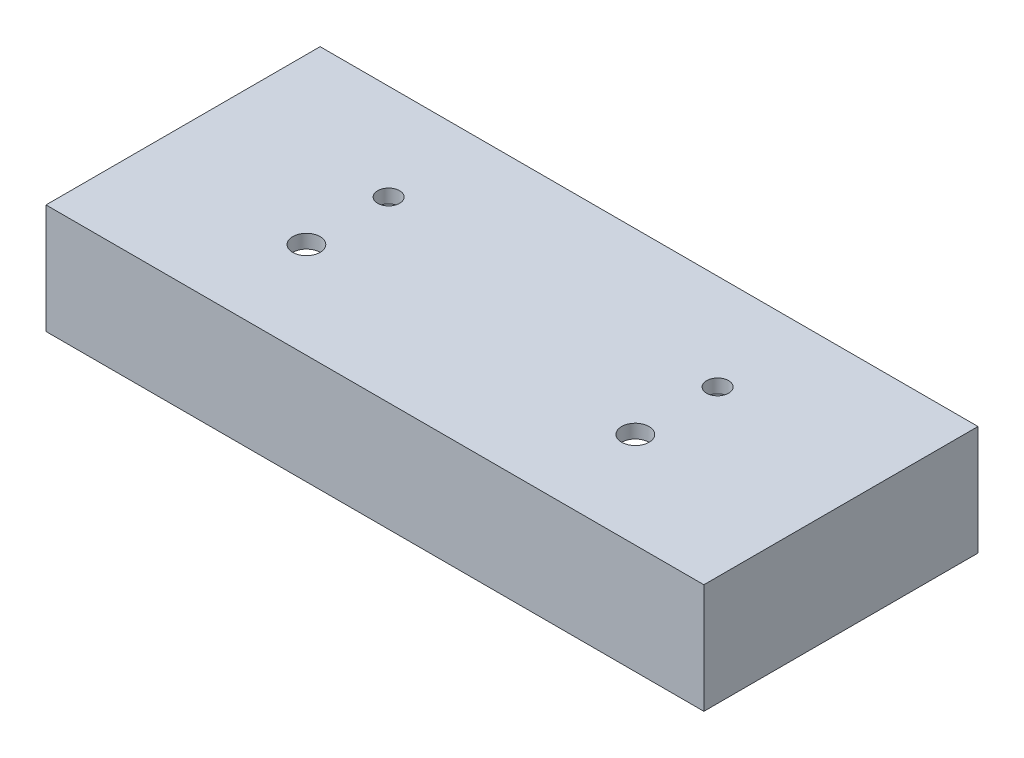
ISO-10303-21;
HEADER;
FILE_DESCRIPTION(('STEP AP214'),'2;1');
FILE_NAME('part.step','',(''),(''),'','','');
FILE_SCHEMA(('AUTOMOTIVE_DESIGN { 1 0 10303 214 1 1 1 1 }'));
ENDSEC;
DATA;
#1=APPLICATION_CONTEXT('core data for automotive mechanical design processes');
#2=APPLICATION_PROTOCOL_DEFINITION('international standard','automotive_design',2000,#1);
#3=PRODUCT_CONTEXT('',#1,'mechanical');
#4=PRODUCT('Part','Part','',(#3));
#5=PRODUCT_RELATED_PRODUCT_CATEGORY('part','',(#4));
#6=PRODUCT_DEFINITION_FORMATION('','',#4);
#7=PRODUCT_DEFINITION_CONTEXT('part definition',#1,'design');
#8=PRODUCT_DEFINITION('design','',#6,#7);
#9=PRODUCT_DEFINITION_SHAPE('','',#8);
#10=(LENGTH_UNIT() NAMED_UNIT(*) SI_UNIT(.MILLI.,.METRE.));
#11=(NAMED_UNIT(*) PLANE_ANGLE_UNIT() SI_UNIT($,.RADIAN.));
#12=(NAMED_UNIT(*) SI_UNIT($,.STERADIAN.) SOLID_ANGLE_UNIT());
#13=UNCERTAINTY_MEASURE_WITH_UNIT(LENGTH_MEASURE(1.E-05),#10,'distance_accuracy_value','');
#14=(GEOMETRIC_REPRESENTATION_CONTEXT(3) GLOBAL_UNCERTAINTY_ASSIGNED_CONTEXT((#13)) GLOBAL_UNIT_ASSIGNED_CONTEXT((#10,
#11,#12)) REPRESENTATION_CONTEXT('',''));
#15=CARTESIAN_POINT('',(0.,0.,0.));
#16=DIRECTION('',(0.,0.,1.));
#17=DIRECTION('',(1.,0.,0.));
#18=AXIS2_PLACEMENT_3D('',#15,#16,#17);
#19=CARTESIAN_POINT('',(152.4,50.8,63.5));
#20=DIRECTION('',(-1.,0.,0.));
#21=DIRECTION('',(0.,0.,1.));
#22=AXIS2_PLACEMENT_3D('',#19,#20,#21);
#23=PLANE('',#22);
#24=DIRECTION('',(0.,0.,-1.));
#25=VECTOR('',#24,1.);
#26=CARTESIAN_POINT('',(152.4,0.,63.5));
#27=LINE('',#26,#25);
#28=CARTESIAN_POINT('',(152.4,0.,63.5));
#29=VERTEX_POINT('',#28);
#30=CARTESIAN_POINT('',(152.4,0.,-63.5));
#31=VERTEX_POINT('',#30);
#32=EDGE_CURVE('E149',#29,#31,#27,.T.);
#33=ORIENTED_EDGE('',*,*,#32,.T.);
#34=DIRECTION('',(0.,-1.,0.));
#35=VECTOR('',#34,1.);
#36=CARTESIAN_POINT('',(152.4,50.8,-63.5));
#37=LINE('',#36,#35);
#38=CARTESIAN_POINT('',(152.4,50.8,-63.5));
#39=VERTEX_POINT('',#38);
#40=EDGE_CURVE('E11',#39,#31,#37,.T.);
#41=ORIENTED_EDGE('',*,*,#40,.F.);
#42=DIRECTION('',(0.,0.,-1.));
#43=VECTOR('',#42,1.);
#44=CARTESIAN_POINT('',(152.4,50.8,63.5));
#45=LINE('',#44,#43);
#46=CARTESIAN_POINT('',(152.4,50.8,63.5));
#47=VERTEX_POINT('',#46);
#48=EDGE_CURVE('E153',#47,#39,#45,.T.);
#49=ORIENTED_EDGE('',*,*,#48,.F.);
#50=DIRECTION('',(0.,-1.,0.));
#51=VECTOR('',#50,1.);
#52=CARTESIAN_POINT('',(152.4,50.8,63.5));
#53=LINE('',#52,#51);
#54=EDGE_CURVE('E159',#47,#29,#53,.T.);
#55=ORIENTED_EDGE('',*,*,#54,.T.);
#56=EDGE_LOOP('',(#33,#41,#49,#55));
#57=FACE_BOUND('',#56,.T.);
#58=ADVANCED_FACE('F36',(#57),#23,.F.);
#59=CARTESIAN_POINT('',(-152.4,50.8,-63.5));
#60=DIRECTION('',(0.,0.,1.));
#61=DIRECTION('',(1.,0.,0.));
#62=AXIS2_PLACEMENT_3D('',#59,#60,#61);
#63=PLANE('',#62);
#64=DIRECTION('',(-1.,0.,0.));
#65=VECTOR('',#64,1.);
#66=CARTESIAN_POINT('',(-152.4,0.,-63.5));
#67=LINE('',#66,#65);
#68=CARTESIAN_POINT('',(-152.4,0.,-63.5));
#69=VERTEX_POINT('',#68);
#70=EDGE_CURVE('E162',#31,#69,#67,.T.);
#71=ORIENTED_EDGE('',*,*,#70,.T.);
#72=DIRECTION('',(0.,-1.,0.));
#73=VECTOR('',#72,1.);
#74=CARTESIAN_POINT('',(-152.4,50.8,-63.5));
#75=LINE('',#74,#73);
#76=CARTESIAN_POINT('',(-152.4,50.8,-63.5));
#77=VERTEX_POINT('',#76);
#78=EDGE_CURVE('E44',#77,#69,#75,.T.);
#79=ORIENTED_EDGE('',*,*,#78,.F.);
#80=DIRECTION('',(-1.,0.,0.));
#81=VECTOR('',#80,1.);
#82=CARTESIAN_POINT('',(-152.4,50.8,-63.5));
#83=LINE('',#82,#81);
#84=EDGE_CURVE('E89',#39,#77,#83,.T.);
#85=ORIENTED_EDGE('',*,*,#84,.F.);
#86=ORIENTED_EDGE('',*,*,#40,.T.);
#87=EDGE_LOOP('',(#71,#79,#85,#86));
#88=FACE_BOUND('',#87,.T.);
#89=ADVANCED_FACE('F225',(#88),#63,.F.);
#90=CARTESIAN_POINT('',(-152.4,50.8,63.5));
#91=DIRECTION('',(1.,0.,0.));
#92=DIRECTION('',(0.,0.,-1.));
#93=AXIS2_PLACEMENT_3D('',#90,#91,#92);
#94=PLANE('',#93);
#95=DIRECTION('',(0.,0.,1.));
#96=VECTOR('',#95,1.);
#97=CARTESIAN_POINT('',(-152.4,0.,63.5));
#98=LINE('',#97,#96);
#99=CARTESIAN_POINT('',(-152.4,0.,63.5));
#100=VERTEX_POINT('',#99);
#101=EDGE_CURVE('E164',#69,#100,#98,.T.);
#102=ORIENTED_EDGE('',*,*,#101,.T.);
#103=DIRECTION('',(0.,-1.,0.));
#104=VECTOR('',#103,1.);
#105=CARTESIAN_POINT('',(-152.4,50.8,63.5));
#106=LINE('',#105,#104);
#107=CARTESIAN_POINT('',(-152.4,50.8,63.5));
#108=VERTEX_POINT('',#107);
#109=EDGE_CURVE('E168',#108,#100,#106,.T.);
#110=ORIENTED_EDGE('',*,*,#109,.F.);
#111=DIRECTION('',(0.,0.,1.));
#112=VECTOR('',#111,1.);
#113=CARTESIAN_POINT('',(-152.4,50.8,63.5));
#114=LINE('',#113,#112);
#115=EDGE_CURVE('E156',#77,#108,#114,.T.);
#116=ORIENTED_EDGE('',*,*,#115,.F.);
#117=ORIENTED_EDGE('',*,*,#78,.T.);
#118=EDGE_LOOP('',(#102,#110,#116,#117));
#119=FACE_BOUND('',#118,.T.);
#120=ADVANCED_FACE('F230',(#119),#94,.F.);
#121=CARTESIAN_POINT('',(-152.4,50.8,63.5));
#122=DIRECTION('',(0.,0.,-1.));
#123=DIRECTION('',(-1.,0.,0.));
#124=AXIS2_PLACEMENT_3D('',#121,#122,#123);
#125=PLANE('',#124);
#126=DIRECTION('',(1.,0.,0.));
#127=VECTOR('',#126,1.);
#128=CARTESIAN_POINT('',(-152.4,0.,63.5));
#129=LINE('',#128,#127);
#130=EDGE_CURVE('E82',#100,#29,#129,.T.);
#131=ORIENTED_EDGE('',*,*,#130,.T.);
#132=ORIENTED_EDGE('',*,*,#54,.F.);
#133=DIRECTION('',(1.,0.,0.));
#134=VECTOR('',#133,1.);
#135=CARTESIAN_POINT('',(-152.4,50.8,63.5));
#136=LINE('',#135,#134);
#137=EDGE_CURVE('E61',#108,#47,#136,.T.);
#138=ORIENTED_EDGE('',*,*,#137,.F.);
#139=ORIENTED_EDGE('',*,*,#109,.T.);
#140=EDGE_LOOP('',(#131,#132,#138,#139));
#141=FACE_BOUND('',#140,.T.);
#142=ADVANCED_FACE('F218',(#141),#125,.F.);
#143=CARTESIAN_POINT('',(0.,50.8,0.));
#144=DIRECTION('',(0.,-1.,0.));
#145=DIRECTION('',(0.,0.,-1.));
#146=AXIS2_PLACEMENT_3D('',#143,#144,#145);
#147=PLANE('',#146);
#148=CARTESIAN_POINT('',(76.1999999999999,50.8,-19.05));
#149=DIRECTION('',(0.,1.,0.));
#150=DIRECTION('',(0.,0.,-1.));
#151=AXIS2_PLACEMENT_3D('',#148,#149,#150);
#152=CIRCLE('',#151,5.08);
#153=CARTESIAN_POINT('',(76.1999999999999,50.8,-24.13));
#154=VERTEX_POINT('',#153);
#155=EDGE_CURVE('E203',#154,#154,#152,.T.);
#156=ORIENTED_EDGE('',*,*,#155,.F.);
#157=EDGE_LOOP('',(#156));
#158=FACE_BOUND('',#157,.T.);
#159=CARTESIAN_POINT('',(-76.2,50.8,19.05));
#160=DIRECTION('',(0.,1.,0.));
#161=DIRECTION('',(0.,0.,1.));
#162=AXIS2_PLACEMENT_3D('',#159,#160,#161);
#163=CIRCLE('',#162,6.35);
#164=CARTESIAN_POINT('',(-76.2,50.8,25.4));
#165=VERTEX_POINT('',#164);
#166=EDGE_CURVE('E205',#165,#165,#163,.T.);
#167=ORIENTED_EDGE('',*,*,#166,.F.);
#168=EDGE_LOOP('',(#167));
#169=FACE_BOUND('',#168,.T.);
#170=CARTESIAN_POINT('',(76.2,50.8,19.05));
#171=DIRECTION('',(0.,1.,0.));
#172=DIRECTION('',(0.,0.,1.));
#173=AXIS2_PLACEMENT_3D('',#170,#171,#172);
#174=CIRCLE('',#173,6.35);
#175=CARTESIAN_POINT('',(76.2,50.8,25.4));
#176=VERTEX_POINT('',#175);
#177=EDGE_CURVE('E209',#176,#176,#174,.T.);
#178=ORIENTED_EDGE('',*,*,#177,.F.);
#179=EDGE_LOOP('',(#178));
#180=FACE_BOUND('',#179,.T.);
#181=CARTESIAN_POINT('',(-76.2000000000001,50.8,-19.05));
#182=DIRECTION('',(0.,1.,0.));
#183=DIRECTION('',(0.,0.,1.));
#184=AXIS2_PLACEMENT_3D('',#181,#182,#183);
#185=CIRCLE('',#184,5.08);
#186=CARTESIAN_POINT('',(-76.2000000000001,50.8,-13.97));
#187=VERTEX_POINT('',#186);
#188=EDGE_CURVE('E137',#187,#187,#185,.T.);
#189=ORIENTED_EDGE('',*,*,#188,.F.);
#190=EDGE_LOOP('',(#189));
#191=FACE_BOUND('',#190,.T.);
#192=ORIENTED_EDGE('',*,*,#48,.T.);
#193=ORIENTED_EDGE('',*,*,#84,.T.);
#194=ORIENTED_EDGE('',*,*,#115,.T.);
#195=ORIENTED_EDGE('',*,*,#137,.T.);
#196=EDGE_LOOP('',(#192,#193,#194,#195));
#197=FACE_BOUND('',#196,.T.);
#198=ADVANCED_FACE('F215',(#158,#169,#180,#191,#197),#147,.F.);
#199=CARTESIAN_POINT('',(0.,0.,0.));
#200=DIRECTION('',(0.,-1.,0.));
#201=DIRECTION('',(0.,0.,-1.));
#202=AXIS2_PLACEMENT_3D('',#199,#200,#201);
#203=PLANE('',#202);
#204=DIRECTION('',(0.,0.,1.));
#205=VECTOR('',#204,1.);
#206=CARTESIAN_POINT('',(139.7,0.,50.8));
#207=LINE('',#206,#205);
#208=CARTESIAN_POINT('',(139.7,0.,-50.8));
#209=VERTEX_POINT('',#208);
#210=CARTESIAN_POINT('',(139.7,0.,50.8));
#211=VERTEX_POINT('',#210);
#212=EDGE_CURVE('E52',#209,#211,#207,.T.);
#213=ORIENTED_EDGE('',*,*,#212,.F.);
#214=DIRECTION('',(1.,0.,0.));
#215=VECTOR('',#214,1.);
#216=CARTESIAN_POINT('',(-139.7,0.,-50.8));
#217=LINE('',#216,#215);
#218=CARTESIAN_POINT('',(-139.7,0.,-50.8));
#219=VERTEX_POINT('',#218);
#220=EDGE_CURVE('E131',#219,#209,#217,.T.);
#221=ORIENTED_EDGE('',*,*,#220,.F.);
#222=DIRECTION('',(0.,0.,-1.));
#223=VECTOR('',#222,1.);
#224=CARTESIAN_POINT('',(-139.7,0.,50.8));
#225=LINE('',#224,#223);
#226=CARTESIAN_POINT('',(-139.7,0.,50.8));
#227=VERTEX_POINT('',#226);
#228=EDGE_CURVE('E134',#227,#219,#225,.T.);
#229=ORIENTED_EDGE('',*,*,#228,.F.);
#230=DIRECTION('',(-1.,0.,0.));
#231=VECTOR('',#230,1.);
#232=CARTESIAN_POINT('',(-139.7,0.,50.8));
#233=LINE('',#232,#231);
#234=EDGE_CURVE('E143',#211,#227,#233,.T.);
#235=ORIENTED_EDGE('',*,*,#234,.F.);
#236=EDGE_LOOP('',(#213,#221,#229,#235));
#237=FACE_BOUND('',#236,.T.);
#238=ORIENTED_EDGE('',*,*,#32,.F.);
#239=ORIENTED_EDGE('',*,*,#130,.F.);
#240=ORIENTED_EDGE('',*,*,#101,.F.);
#241=ORIENTED_EDGE('',*,*,#70,.F.);
#242=EDGE_LOOP('',(#238,#239,#240,#241));
#243=FACE_BOUND('',#242,.T.);
#244=ADVANCED_FACE('F217',(#237,#243),#203,.T.);
#245=CARTESIAN_POINT('',(139.7,44.45,50.8));
#246=DIRECTION('',(1.,0.,0.));
#247=DIRECTION('',(0.,0.,-1.));
#248=AXIS2_PLACEMENT_3D('',#245,#246,#247);
#249=PLANE('',#248);
#250=ORIENTED_EDGE('',*,*,#212,.T.);
#251=DIRECTION('',(0.,-1.,0.));
#252=VECTOR('',#251,1.);
#253=CARTESIAN_POINT('',(139.7,44.45,50.8));
#254=LINE('',#253,#252);
#255=CARTESIAN_POINT('',(139.7,44.45,50.8));
#256=VERTEX_POINT('',#255);
#257=EDGE_CURVE('E109',#256,#211,#254,.T.);
#258=ORIENTED_EDGE('',*,*,#257,.F.);
#259=DIRECTION('',(0.,0.,1.));
#260=VECTOR('',#259,1.);
#261=CARTESIAN_POINT('',(139.7,44.45,50.8));
#262=LINE('',#261,#260);
#263=CARTESIAN_POINT('',(139.7,44.45,-50.8));
#264=VERTEX_POINT('',#263);
#265=EDGE_CURVE('E113',#264,#256,#262,.T.);
#266=ORIENTED_EDGE('',*,*,#265,.F.);
#267=DIRECTION('',(0.,-1.,0.));
#268=VECTOR('',#267,1.);
#269=CARTESIAN_POINT('',(139.7,44.45,-50.8));
#270=LINE('',#269,#268);
#271=EDGE_CURVE('E147',#264,#209,#270,.T.);
#272=ORIENTED_EDGE('',*,*,#271,.T.);
#273=EDGE_LOOP('',(#250,#258,#266,#272));
#274=FACE_BOUND('',#273,.T.);
#275=ADVANCED_FACE('F111',(#274),#249,.F.);
#276=CARTESIAN_POINT('',(-139.7,44.45,-50.8));
#277=DIRECTION('',(0.,0.,-1.));
#278=DIRECTION('',(-1.,0.,0.));
#279=AXIS2_PLACEMENT_3D('',#276,#277,#278);
#280=PLANE('',#279);
#281=ORIENTED_EDGE('',*,*,#220,.T.);
#282=ORIENTED_EDGE('',*,*,#271,.F.);
#283=DIRECTION('',(1.,0.,0.));
#284=VECTOR('',#283,1.);
#285=CARTESIAN_POINT('',(-139.7,44.45,-50.8));
#286=LINE('',#285,#284);
#287=CARTESIAN_POINT('',(-139.7,44.45,-50.8));
#288=VERTEX_POINT('',#287);
#289=EDGE_CURVE('E119',#288,#264,#286,.T.);
#290=ORIENTED_EDGE('',*,*,#289,.F.);
#291=DIRECTION('',(0.,-1.,0.));
#292=VECTOR('',#291,1.);
#293=CARTESIAN_POINT('',(-139.7,44.45,-50.8));
#294=LINE('',#293,#292);
#295=EDGE_CURVE('E150',#288,#219,#294,.T.);
#296=ORIENTED_EDGE('',*,*,#295,.T.);
#297=EDGE_LOOP('',(#281,#282,#290,#296));
#298=FACE_BOUND('',#297,.T.);
#299=ADVANCED_FACE('F238',(#298),#280,.F.);
#300=CARTESIAN_POINT('',(-139.7,44.45,50.8));
#301=DIRECTION('',(-1.,0.,0.));
#302=DIRECTION('',(0.,0.,1.));
#303=AXIS2_PLACEMENT_3D('',#300,#301,#302);
#304=PLANE('',#303);
#305=ORIENTED_EDGE('',*,*,#228,.T.);
#306=ORIENTED_EDGE('',*,*,#295,.F.);
#307=DIRECTION('',(0.,0.,-1.));
#308=VECTOR('',#307,1.);
#309=CARTESIAN_POINT('',(-139.7,44.45,50.8));
#310=LINE('',#309,#308);
#311=CARTESIAN_POINT('',(-139.7,44.45,50.8));
#312=VERTEX_POINT('',#311);
#313=EDGE_CURVE('E127',#312,#288,#310,.T.);
#314=ORIENTED_EDGE('',*,*,#313,.F.);
#315=DIRECTION('',(0.,-1.,0.));
#316=VECTOR('',#315,1.);
#317=CARTESIAN_POINT('',(-139.7,44.45,50.8));
#318=LINE('',#317,#316);
#319=EDGE_CURVE('E118',#312,#227,#318,.T.);
#320=ORIENTED_EDGE('',*,*,#319,.T.);
#321=EDGE_LOOP('',(#305,#306,#314,#320));
#322=FACE_BOUND('',#321,.T.);
#323=ADVANCED_FACE('F309',(#322),#304,.F.);
#324=CARTESIAN_POINT('',(-139.7,44.45,50.8));
#325=DIRECTION('',(0.,0.,1.));
#326=DIRECTION('',(1.,0.,0.));
#327=AXIS2_PLACEMENT_3D('',#324,#325,#326);
#328=PLANE('',#327);
#329=ORIENTED_EDGE('',*,*,#234,.T.);
#330=ORIENTED_EDGE('',*,*,#319,.F.);
#331=DIRECTION('',(-1.,0.,0.));
#332=VECTOR('',#331,1.);
#333=CARTESIAN_POINT('',(-139.7,44.45,50.8));
#334=LINE('',#333,#332);
#335=EDGE_CURVE('E122',#256,#312,#334,.T.);
#336=ORIENTED_EDGE('',*,*,#335,.F.);
#337=ORIENTED_EDGE('',*,*,#257,.T.);
#338=EDGE_LOOP('',(#329,#330,#336,#337));
#339=FACE_BOUND('',#338,.T.);
#340=ADVANCED_FACE('F123',(#339),#328,.F.);
#341=CARTESIAN_POINT('',(0.,44.45,0.));
#342=DIRECTION('',(0.,-1.,0.));
#343=DIRECTION('',(0.,0.,-1.));
#344=AXIS2_PLACEMENT_3D('',#341,#342,#343);
#345=PLANE('',#344);
#346=CARTESIAN_POINT('',(76.1999999999999,44.45,-19.05));
#347=DIRECTION('',(0.,-1.,0.));
#348=DIRECTION('',(0.,0.,-1.));
#349=AXIS2_PLACEMENT_3D('',#346,#347,#348);
#350=CIRCLE('',#349,5.08);
#351=CARTESIAN_POINT('',(76.1999999999999,44.45,-24.13));
#352=VERTEX_POINT('',#351);
#353=EDGE_CURVE('E39',#352,#352,#350,.T.);
#354=ORIENTED_EDGE('',*,*,#353,.F.);
#355=EDGE_LOOP('',(#354));
#356=FACE_BOUND('',#355,.T.);
#357=CARTESIAN_POINT('',(-76.2,44.45,19.05));
#358=DIRECTION('',(0.,-1.,0.));
#359=DIRECTION('',(0.,0.,-1.));
#360=AXIS2_PLACEMENT_3D('',#357,#358,#359);
#361=CIRCLE('',#360,6.35);
#362=CARTESIAN_POINT('',(-76.2,44.45,12.7));
#363=VERTEX_POINT('',#362);
#364=EDGE_CURVE('E177',#363,#363,#361,.T.);
#365=ORIENTED_EDGE('',*,*,#364,.F.);
#366=EDGE_LOOP('',(#365));
#367=FACE_BOUND('',#366,.T.);
#368=CARTESIAN_POINT('',(76.2,44.45,19.05));
#369=DIRECTION('',(0.,-1.,0.));
#370=DIRECTION('',(0.,0.,-1.));
#371=AXIS2_PLACEMENT_3D('',#368,#369,#370);
#372=CIRCLE('',#371,6.35);
#373=CARTESIAN_POINT('',(76.2,44.45,12.7));
#374=VERTEX_POINT('',#373);
#375=EDGE_CURVE('E175',#374,#374,#372,.T.);
#376=ORIENTED_EDGE('',*,*,#375,.F.);
#377=EDGE_LOOP('',(#376));
#378=FACE_BOUND('',#377,.T.);
#379=CARTESIAN_POINT('',(-76.2000000000001,44.45,-19.05));
#380=DIRECTION('',(0.,-1.,0.));
#381=DIRECTION('',(0.,0.,-1.));
#382=AXIS2_PLACEMENT_3D('',#379,#380,#381);
#383=CIRCLE('',#382,5.08);
#384=CARTESIAN_POINT('',(-76.2000000000001,44.45,-24.13));
#385=VERTEX_POINT('',#384);
#386=EDGE_CURVE('E172',#385,#385,#383,.T.);
#387=ORIENTED_EDGE('',*,*,#386,.F.);
#388=EDGE_LOOP('',(#387));
#389=FACE_BOUND('',#388,.T.);
#390=ORIENTED_EDGE('',*,*,#265,.T.);
#391=ORIENTED_EDGE('',*,*,#335,.T.);
#392=ORIENTED_EDGE('',*,*,#313,.T.);
#393=ORIENTED_EDGE('',*,*,#289,.T.);
#394=EDGE_LOOP('',(#390,#391,#392,#393));
#395=FACE_BOUND('',#394,.T.);
#396=ADVANCED_FACE('F129',(#356,#367,#378,#389,#395),#345,.T.);
#397=CARTESIAN_POINT('',(-76.2000000000001,38.1,-19.05));
#398=DIRECTION('',(0.,1.,0.));
#399=DIRECTION('',(0.,0.,1.));
#400=AXIS2_PLACEMENT_3D('',#397,#398,#399);
#401=CYLINDRICAL_SURFACE('',#400,5.08);
#402=ORIENTED_EDGE('',*,*,#386,.T.);
#403=EDGE_LOOP('',(#402));
#404=FACE_BOUND('',#403,.T.);
#405=ORIENTED_EDGE('',*,*,#188,.T.);
#406=EDGE_LOOP('',(#405));
#407=FACE_BOUND('',#406,.T.);
#408=ADVANCED_FACE('F189',(#404,#407),#401,.F.);
#409=CARTESIAN_POINT('',(76.2,38.1,19.05));
#410=DIRECTION('',(0.,1.,0.));
#411=DIRECTION('',(0.,0.,1.));
#412=AXIS2_PLACEMENT_3D('',#409,#410,#411);
#413=CYLINDRICAL_SURFACE('',#412,6.35);
#414=ORIENTED_EDGE('',*,*,#375,.T.);
#415=EDGE_LOOP('',(#414));
#416=FACE_BOUND('',#415,.T.);
#417=ORIENTED_EDGE('',*,*,#177,.T.);
#418=EDGE_LOOP('',(#417));
#419=FACE_BOUND('',#418,.T.);
#420=ADVANCED_FACE('F198',(#416,#419),#413,.F.);
#421=CARTESIAN_POINT('',(-76.2,38.1,19.05));
#422=DIRECTION('',(0.,1.,0.));
#423=DIRECTION('',(0.,0.,1.));
#424=AXIS2_PLACEMENT_3D('',#421,#422,#423);
#425=CYLINDRICAL_SURFACE('',#424,6.35);
#426=ORIENTED_EDGE('',*,*,#364,.T.);
#427=EDGE_LOOP('',(#426));
#428=FACE_BOUND('',#427,.T.);
#429=ORIENTED_EDGE('',*,*,#166,.T.);
#430=EDGE_LOOP('',(#429));
#431=FACE_BOUND('',#430,.T.);
#432=ADVANCED_FACE('F285',(#428,#431),#425,.F.);
#433=CARTESIAN_POINT('',(76.1999999999999,38.1,-19.05));
#434=DIRECTION('',(0.,1.,0.));
#435=DIRECTION('',(0.,0.,1.));
#436=AXIS2_PLACEMENT_3D('',#433,#434,#435);
#437=CYLINDRICAL_SURFACE('',#436,5.08);
#438=ORIENTED_EDGE('',*,*,#353,.T.);
#439=EDGE_LOOP('',(#438));
#440=FACE_BOUND('',#439,.T.);
#441=ORIENTED_EDGE('',*,*,#155,.T.);
#442=EDGE_LOOP('',(#441));
#443=FACE_BOUND('',#442,.T.);
#444=ADVANCED_FACE('F184',(#440,#443),#437,.F.);
#445=CLOSED_SHELL('',(#58,#89,#120,#142,#198,#244,#275,#299,#323,#340,#396,#408,#420,#432,#444));
#446=MANIFOLD_SOLID_BREP('B2',#445);
#447=ADVANCED_BREP_SHAPE_REPRESENTATION('',(#18,#446),#14);
#448=SHAPE_DEFINITION_REPRESENTATION(#9,#447);
ENDSEC;
END-ISO-10303-21;
